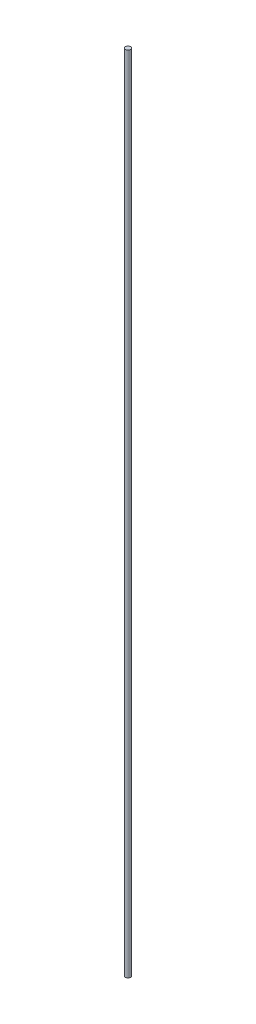
ISO-10303-21;
HEADER;
FILE_DESCRIPTION(('STEP AP214'),'2;1');
FILE_NAME('part.step','',(''),(''),'','','');
FILE_SCHEMA(('AUTOMOTIVE_DESIGN { 1 0 10303 214 1 1 1 1 }'));
ENDSEC;
DATA;
#1=APPLICATION_CONTEXT('core data for automotive mechanical design processes');
#2=APPLICATION_PROTOCOL_DEFINITION('international standard','automotive_design',2000,#1);
#3=PRODUCT_CONTEXT('',#1,'mechanical');
#4=PRODUCT('Part','Part','',(#3));
#5=PRODUCT_RELATED_PRODUCT_CATEGORY('part','',(#4));
#6=PRODUCT_DEFINITION_FORMATION('','',#4);
#7=PRODUCT_DEFINITION_CONTEXT('part definition',#1,'design');
#8=PRODUCT_DEFINITION('design','',#6,#7);
#9=PRODUCT_DEFINITION_SHAPE('','',#8);
#10=(LENGTH_UNIT() NAMED_UNIT(*) SI_UNIT(.MILLI.,.METRE.));
#11=(NAMED_UNIT(*) PLANE_ANGLE_UNIT() SI_UNIT($,.RADIAN.));
#12=(NAMED_UNIT(*) SI_UNIT($,.STERADIAN.) SOLID_ANGLE_UNIT());
#13=UNCERTAINTY_MEASURE_WITH_UNIT(LENGTH_MEASURE(1.E-05),#10,'distance_accuracy_value','');
#14=(GEOMETRIC_REPRESENTATION_CONTEXT(3) GLOBAL_UNCERTAINTY_ASSIGNED_CONTEXT((#13)) GLOBAL_UNIT_ASSIGNED_CONTEXT((#10,
#11,#12)) REPRESENTATION_CONTEXT('',''));
#15=CARTESIAN_POINT('',(0.,0.,0.));
#16=DIRECTION('',(0.,0.,1.));
#17=DIRECTION('',(1.,0.,0.));
#18=AXIS2_PLACEMENT_3D('',#15,#16,#17);
#19=CARTESIAN_POINT('',(0.,3989.82267005903,0.));
#20=DIRECTION('',(0.,-1.,0.));
#21=DIRECTION('',(0.,0.,-1.));
#22=AXIS2_PLACEMENT_3D('',#19,#20,#21);
#23=CYLINDRICAL_SURFACE('',#22,12.7);
#24=CARTESIAN_POINT('',(0.,3989.82267005903,0.));
#25=DIRECTION('',(0.,1.,0.));
#26=DIRECTION('',(0.,0.,1.));
#27=AXIS2_PLACEMENT_3D('',#24,#25,#26);
#28=CIRCLE('',#27,12.7);
#29=CARTESIAN_POINT('',(0.,3989.82267005903,-12.7));
#30=VERTEX_POINT('',#29);
#31=EDGE_CURVE('E11',#30,#30,#28,.T.);
#32=CARTESIAN_POINT('',(0.,0.,0.));
#33=DIRECTION('',(0.,1.,0.));
#34=DIRECTION('',(0.,0.,1.));
#35=AXIS2_PLACEMENT_3D('',#32,#33,#34);
#36=CIRCLE('',#35,12.7);
#37=CARTESIAN_POINT('',(0.,-4.44089209850063E-13,-12.7));
#38=VERTEX_POINT('',#37);
#39=EDGE_CURVE('E47',#38,#38,#36,.T.);
#40=CARTESIAN_POINT('',(0.,3989.82267005903,-12.7));
#41=CARTESIAN_POINT('',(0.,3948.26201724592,-12.7));
#42=CARTESIAN_POINT('',(0.,3906.7013644328,-12.7));
#43=CARTESIAN_POINT('',(0.,3823.58005880657,-12.7));
#44=CARTESIAN_POINT('',(0.,3782.01940599346,-12.7));
#45=CARTESIAN_POINT('',(0.,3698.89810036723,-12.7));
#46=CARTESIAN_POINT('',(0.,3657.33744755411,-12.7));
#47=CARTESIAN_POINT('',(0.,3574.21614192788,-12.7));
#48=CARTESIAN_POINT('',(0.,3532.65548911477,-12.7));
#49=CARTESIAN_POINT('',(0.,3449.53418348854,-12.7));
#50=CARTESIAN_POINT('',(0.,3407.97353067542,-12.7));
#51=CARTESIAN_POINT('',(0.,3324.85222504919,-12.7));
#52=CARTESIAN_POINT('',(0.,3283.29157223608,-12.7));
#53=CARTESIAN_POINT('',(0.,3200.17026660985,-12.7));
#54=CARTESIAN_POINT('',(0.,3158.60961379674,-12.7));
#55=CARTESIAN_POINT('',(0.,3075.48830817051,-12.7));
#56=CARTESIAN_POINT('',(0.,3033.92765535739,-12.7));
#57=CARTESIAN_POINT('',(0.,2950.80634973116,-12.7));
#58=CARTESIAN_POINT('',(0.,2909.24569691805,-12.7));
#59=CARTESIAN_POINT('',(0.,2826.12439129182,-12.7));
#60=CARTESIAN_POINT('',(0.,2784.5637384787,-12.7));
#61=CARTESIAN_POINT('',(0.,2701.44243285247,-12.7));
#62=CARTESIAN_POINT('',(0.,2659.88178003936,-12.7));
#63=CARTESIAN_POINT('',(0.,2576.76047441313,-12.7));
#64=CARTESIAN_POINT('',(0.,2535.19982160001,-12.7));
#65=CARTESIAN_POINT('',(0.,2452.07851597378,-12.7));
#66=CARTESIAN_POINT('',(0.,2410.51786316067,-12.7));
#67=CARTESIAN_POINT('',(0.,2327.39655753444,-12.7));
#68=CARTESIAN_POINT('',(0.,2285.83590472132,-12.7));
#69=CARTESIAN_POINT('',(0.,2202.71459909509,-12.7));
#70=CARTESIAN_POINT('',(0.,2161.15394628198,-12.7));
#71=CARTESIAN_POINT('',(0.,2078.03264065575,-12.7));
#72=CARTESIAN_POINT('',(0.,2036.47198784263,-12.7));
#73=CARTESIAN_POINT('',(0.,1953.3506822164,-12.7));
#74=CARTESIAN_POINT('',(0.,1911.79002940329,-12.7));
#75=CARTESIAN_POINT('',(0.,1828.66872377706,-12.7));
#76=CARTESIAN_POINT('',(0.,1787.10807096394,-12.7));
#77=CARTESIAN_POINT('',(0.,1703.98676533771,-12.7));
#78=CARTESIAN_POINT('',(0.,1662.4261125246,-12.7));
#79=CARTESIAN_POINT('',(0.,1579.30480689837,-12.7));
#80=CARTESIAN_POINT('',(0.,1537.74415408525,-12.7));
#81=CARTESIAN_POINT('',(0.,1454.62284845902,-12.7));
#82=CARTESIAN_POINT('',(0.,1413.06219564591,-12.7));
#83=CARTESIAN_POINT('',(0.,1329.94089001968,-12.7));
#84=CARTESIAN_POINT('',(0.,1288.38023720656,-12.7));
#85=CARTESIAN_POINT('',(0.,1205.25893158033,-12.7));
#86=CARTESIAN_POINT('',(0.,1163.69827876722,-12.7));
#87=CARTESIAN_POINT('',(0.,1080.57697314099,-12.7));
#88=CARTESIAN_POINT('',(0.,1039.01632032787,-12.7));
#89=CARTESIAN_POINT('',(0.,955.895014701643,-12.7));
#90=CARTESIAN_POINT('',(0.,914.334361888528,-12.7));
#91=CARTESIAN_POINT('',(0.,831.213056262298,-12.7));
#92=CARTESIAN_POINT('',(0.,789.652403449184,-12.7));
#93=CARTESIAN_POINT('',(0.,706.531097822954,-12.7));
#94=CARTESIAN_POINT('',(0.,664.970445009839,-12.7));
#95=CARTESIAN_POINT('',(0.,581.849139383609,-12.7));
#96=CARTESIAN_POINT('',(0.,540.288486570494,-12.7));
#97=CARTESIAN_POINT('',(0.,457.167180944264,-12.7));
#98=CARTESIAN_POINT('',(0.,415.606528131149,-12.7));
#99=CARTESIAN_POINT('',(0.,332.485222504919,-12.7));
#100=CARTESIAN_POINT('',(0.,290.924569691804,-12.7));
#101=CARTESIAN_POINT('',(0.,207.803264065574,-12.7));
#102=CARTESIAN_POINT('',(0.,166.242611252459,-12.7));
#103=CARTESIAN_POINT('',(0.,83.1213056262296,-12.7));
#104=CARTESIAN_POINT('',(0.,41.5606528131145,-12.7));
#105=CARTESIAN_POINT('',(0.,-4.44089209850063E-13,-12.7));
#106=B_SPLINE_CURVE_WITH_KNOTS('',3,(#40,#41,#42,#43,#44,#45,#46,#47,#48,#49,#50,#51,#52,#53,
#54,#55,#56,#57,#58,#59,#60,#61,#62,#63,#64,#65,#66,#67,#68,#69,#70,#71,#72,#73,#74,#75,#76,#77,
#78,#79,#80,#81,#82,#83,#84,#85,#86,#87,#88,#89,#90,#91,#92,#93,#94,#95,#96,#97,#98,#99,#100,
#101,#102,#103,#104,#105),.UNSPECIFIED.,.F.,.F.,(4,2,2,2,2,2,2,2,2,2,2,2,2,2,2,2,2,2,2,2,2,2,2,
2,2,2,2,2,2,2,2,2,4),(0.,124.681958439345,249.36391687869,374.045875318035,498.72783375738,
623.409792196724,748.091750636069,872.773709075414,997.455667514759,1122.1376259541,
1246.81958439345,1371.50154283279,1496.18350127214,1620.86545971148,1745.54741815083,
1870.22937659017,1994.91133502952,2119.59329346886,2244.27525190821,2368.95721034755,
2493.6391687869,2618.32112722624,2743.00308566559,2867.68504410493,2992.36700254428,
3117.04896098362,3241.73091942297,3366.41287786231,3491.09483630166,3615.776794741,
3740.45875318034,3865.14071161969,3989.82267005903),.UNSPECIFIED.);
#107=EDGE_CURVE('BSEAM46',#30,#38,#106,.T.);
#108=ORIENTED_EDGE('',*,*,#31,.F.);
#109=ORIENTED_EDGE('',*,*,#39,.T.);
#110=ORIENTED_EDGE('',*,*,#107,.T.);
#111=ORIENTED_EDGE('',*,*,#107,.F.);
#112=EDGE_LOOP('',(#108,#110,#109,#111));
#113=FACE_BOUND('',#112,.T.);
#114=ADVANCED_FACE('F46',(#113),#23,.T.);
#115=CARTESIAN_POINT('',(0.,3989.82267005903,0.));
#116=DIRECTION('',(0.,1.,0.));
#117=DIRECTION('',(0.,0.,1.));
#118=AXIS2_PLACEMENT_3D('',#115,#116,#117);
#119=PLANE('',#118);
#120=ORIENTED_EDGE('',*,*,#31,.T.);
#121=EDGE_LOOP('',(#120));
#122=FACE_BOUND('',#121,.T.);
#123=ADVANCED_FACE('F65',(#122),#119,.T.);
#124=CARTESIAN_POINT('',(0.,0.,0.));
#125=DIRECTION('',(0.,1.,0.));
#126=DIRECTION('',(0.,0.,1.));
#127=AXIS2_PLACEMENT_3D('',#124,#125,#126);
#128=PLANE('',#127);
#129=ORIENTED_EDGE('',*,*,#39,.F.);
#130=EDGE_LOOP('',(#129));
#131=FACE_BOUND('',#130,.T.);
#132=ADVANCED_FACE('F64',(#131),#128,.F.);
#133=CLOSED_SHELL('',(#114,#123,#132));
#134=MANIFOLD_SOLID_BREP('B2',#133);
#135=ADVANCED_BREP_SHAPE_REPRESENTATION('',(#18,#134),#14);
#136=SHAPE_DEFINITION_REPRESENTATION(#9,#135);
ENDSEC;
END-ISO-10303-21;
